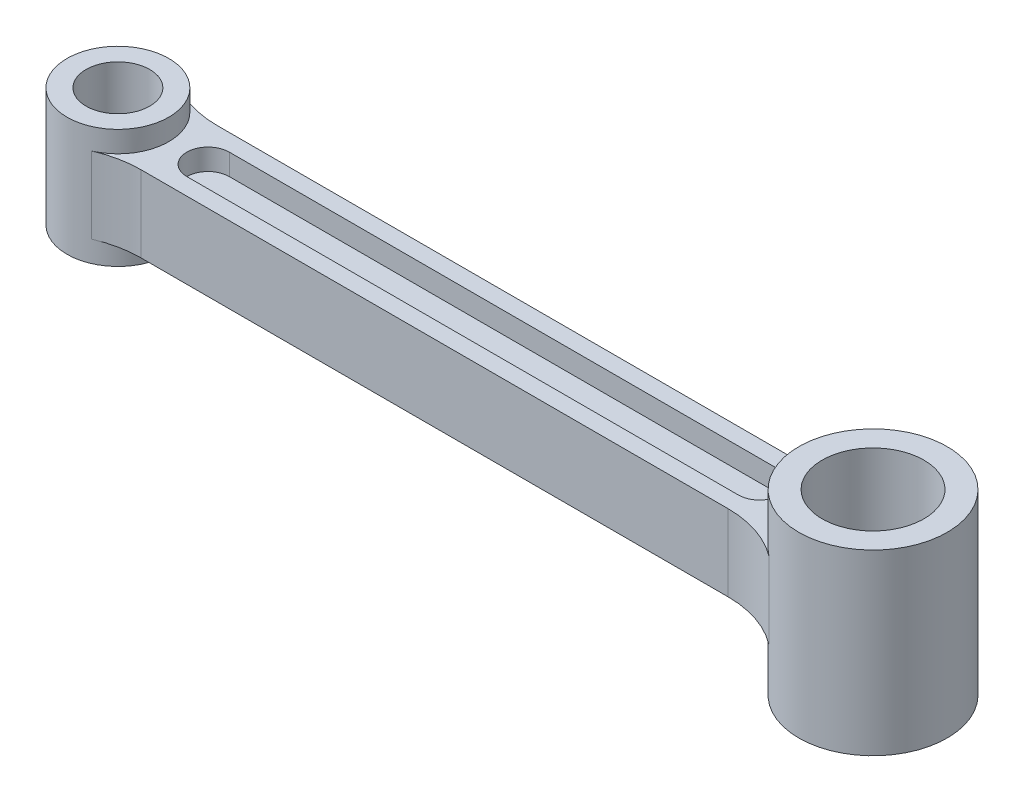
ISO-10303-21;
HEADER;
FILE_DESCRIPTION(('STEP AP214'),'2;1');
FILE_NAME('part.step','',(''),(''),'','','');
FILE_SCHEMA(('AUTOMOTIVE_DESIGN { 1 0 10303 214 1 1 1 1 }'));
ENDSEC;
DATA;
#1=APPLICATION_CONTEXT('core data for automotive mechanical design processes');
#2=APPLICATION_PROTOCOL_DEFINITION('international standard','automotive_design',2000,#1);
#3=PRODUCT_CONTEXT('',#1,'mechanical');
#4=PRODUCT('Part','Part','',(#3));
#5=PRODUCT_RELATED_PRODUCT_CATEGORY('part','',(#4));
#6=PRODUCT_DEFINITION_FORMATION('','',#4);
#7=PRODUCT_DEFINITION_CONTEXT('part definition',#1,'design');
#8=PRODUCT_DEFINITION('design','',#6,#7);
#9=PRODUCT_DEFINITION_SHAPE('','',#8);
#10=(LENGTH_UNIT() NAMED_UNIT(*) SI_UNIT(.MILLI.,.METRE.));
#11=(NAMED_UNIT(*) PLANE_ANGLE_UNIT() SI_UNIT($,.RADIAN.));
#12=(NAMED_UNIT(*) SI_UNIT($,.STERADIAN.) SOLID_ANGLE_UNIT());
#13=UNCERTAINTY_MEASURE_WITH_UNIT(LENGTH_MEASURE(1.E-05),#10,'distance_accuracy_value','');
#14=(GEOMETRIC_REPRESENTATION_CONTEXT(3) GLOBAL_UNCERTAINTY_ASSIGNED_CONTEXT((#13)) GLOBAL_UNIT_ASSIGNED_CONTEXT((#10,
#11,#12)) REPRESENTATION_CONTEXT('',''));
#15=CARTESIAN_POINT('',(0.,0.,0.));
#16=DIRECTION('',(0.,0.,1.));
#17=DIRECTION('',(1.,0.,0.));
#18=AXIS2_PLACEMENT_3D('',#15,#16,#17);
#19=CARTESIAN_POINT('',(0.,-9.,0.));
#20=DIRECTION('',(0.,1.,0.));
#21=DIRECTION('',(0.,0.,1.));
#22=AXIS2_PLACEMENT_3D('',#19,#20,#21);
#23=PLANE('',#22);
#24=CARTESIAN_POINT('',(-39.9456763121572,-9.,33.));
#25=DIRECTION('',(0.,1.,0.));
#26=DIRECTION('',(0.,0.,1.));
#27=AXIS2_PLACEMENT_3D('',#24,#25,#26);
#28=CIRCLE('',#27,24.);
#29=CARTESIAN_POINT('',(-39.9456763121572,-9.,9.));
#30=VERTEX_POINT('',#29);
#31=CARTESIAN_POINT('',(-49.5373393587826,-9.,11.));
#32=VERTEX_POINT('',#31);
#33=EDGE_CURVE('E294',#30,#32,#28,.T.);
#34=ORIENTED_EDGE('',*,*,#33,.T.);
#35=CARTESIAN_POINT('',(-54.3331708820953,-9.,0.));
#36=DIRECTION('',(0.,1.,0.));
#37=DIRECTION('',(0.,0.,1.));
#38=AXIS2_PLACEMENT_3D('',#35,#36,#37);
#39=CIRCLE('',#38,12.);
#40=CARTESIAN_POINT('',(-49.5373393587826,-9.,-11.));
#41=VERTEX_POINT('',#40);
#42=EDGE_CURVE('E305',#32,#41,#39,.T.);
#43=ORIENTED_EDGE('',*,*,#42,.T.);
#44=CARTESIAN_POINT('',(-39.9456763121572,-9.,-33.));
#45=DIRECTION('',(0.,1.,0.));
#46=DIRECTION('',(0.,0.,1.));
#47=AXIS2_PLACEMENT_3D('',#44,#45,#46);
#48=CIRCLE('',#47,24.);
#49=CARTESIAN_POINT('',(-39.9456763121572,-9.,-9.));
#50=VERTEX_POINT('',#49);
#51=EDGE_CURVE('E356',#50,#41,#48,.F.);
#52=ORIENTED_EDGE('',*,*,#51,.F.);
#53=DIRECTION('',(1.,0.,0.));
#54=VECTOR('',#53,1.);
#55=CARTESIAN_POINT('',(0.,-9.,-9.));
#56=LINE('',#55,#54);
#57=CARTESIAN_POINT('',(98.5023700535814,-9.,-9.));
#58=VERTEX_POINT('',#57);
#59=EDGE_CURVE('E352',#50,#58,#56,.T.);
#60=ORIENTED_EDGE('',*,*,#59,.T.);
#61=CARTESIAN_POINT('',(98.5023700535814,-9.,-33.));
#62=DIRECTION('',(0.,1.,0.));
#63=DIRECTION('',(0.,0.,1.));
#64=AXIS2_PLACEMENT_3D('',#61,#62,#63);
#65=CIRCLE('',#64,24.);
#66=CARTESIAN_POINT('',(113.055310235359,-9.,-13.9156626506024));
#67=VERTEX_POINT('',#66);
#68=EDGE_CURVE('E348',#58,#67,#65,.T.);
#69=ORIENTED_EDGE('',*,*,#68,.T.);
#70=CARTESIAN_POINT('',(123.666829117905,-9.,0.));
#71=DIRECTION('',(0.,1.,0.));
#72=DIRECTION('',(0.,0.,1.));
#73=AXIS2_PLACEMENT_3D('',#70,#71,#72);
#74=CIRCLE('',#73,17.5);
#75=CARTESIAN_POINT('',(113.055310235359,-9.,13.9156626506024));
#76=VERTEX_POINT('',#75);
#77=EDGE_CURVE('E344',#67,#76,#74,.T.);
#78=ORIENTED_EDGE('',*,*,#77,.T.);
#79=CARTESIAN_POINT('',(98.5023700535814,-9.,33.));
#80=DIRECTION('',(0.,1.,0.));
#81=DIRECTION('',(0.,0.,1.));
#82=AXIS2_PLACEMENT_3D('',#79,#80,#81);
#83=CIRCLE('',#82,24.);
#84=CARTESIAN_POINT('',(98.5023700535814,-9.,9.));
#85=VERTEX_POINT('',#84);
#86=EDGE_CURVE('E341',#85,#76,#83,.F.);
#87=ORIENTED_EDGE('',*,*,#86,.F.);
#88=DIRECTION('',(1.,0.,0.));
#89=VECTOR('',#88,1.);
#90=CARTESIAN_POINT('',(0.,-9.,9.));
#91=LINE('',#90,#89);
#92=EDGE_CURVE('E337',#30,#85,#91,.T.);
#93=ORIENTED_EDGE('',*,*,#92,.F.);
#94=EDGE_LOOP('',(#34,#43,#52,#60,#69,#78,#87,#93));
#95=FACE_BOUND('',#94,.T.);
#96=CARTESIAN_POINT('',(-33.0831708820953,-9.,0.));
#97=DIRECTION('',(0.,1.,0.));
#98=DIRECTION('',(0.,0.,1.));
#99=AXIS2_PLACEMENT_3D('',#96,#97,#98);
#100=CIRCLE('',#99,5.);
#101=CARTESIAN_POINT('',(-33.0831708820953,-9.,-5.));
#102=VERTEX_POINT('',#101);
#103=CARTESIAN_POINT('',(-33.0831708820953,-9.,5.));
#104=VERTEX_POINT('',#103);
#105=EDGE_CURVE('E95',#102,#104,#100,.T.);
#106=ORIENTED_EDGE('',*,*,#105,.T.);
#107=DIRECTION('',(1.,0.,0.));
#108=VECTOR('',#107,1.);
#109=CARTESIAN_POINT('',(-33.0831708820953,-9.,5.));
#110=LINE('',#109,#108);
#111=CARTESIAN_POINT('',(96.9168291179047,-9.,5.));
#112=VERTEX_POINT('',#111);
#113=EDGE_CURVE('E211',#104,#112,#110,.T.);
#114=ORIENTED_EDGE('',*,*,#113,.T.);
#115=CARTESIAN_POINT('',(96.9168291179047,-9.,0.));
#116=DIRECTION('',(0.,1.,0.));
#117=DIRECTION('',(0.,0.,1.));
#118=AXIS2_PLACEMENT_3D('',#115,#116,#117);
#119=CIRCLE('',#118,5.);
#120=CARTESIAN_POINT('',(96.9168291179047,-9.,-5.));
#121=VERTEX_POINT('',#120);
#122=EDGE_CURVE('E228',#112,#121,#119,.T.);
#123=ORIENTED_EDGE('',*,*,#122,.T.);
#124=DIRECTION('',(1.,0.,0.));
#125=VECTOR('',#124,1.);
#126=CARTESIAN_POINT('',(-33.0831708820953,-9.,-5.));
#127=LINE('',#126,#125);
#128=EDGE_CURVE('E225',#102,#121,#127,.T.);
#129=ORIENTED_EDGE('',*,*,#128,.F.);
#130=EDGE_LOOP('',(#106,#114,#123,#129));
#131=FACE_BOUND('',#130,.T.);
#132=ADVANCED_FACE('F77',(#95,#131),#23,.F.);
#133=CARTESIAN_POINT('',(-54.3331708820953,14.,0.));
#134=DIRECTION('',(0.,-1.,0.));
#135=DIRECTION('',(0.,0.,-1.));
#136=AXIS2_PLACEMENT_3D('',#133,#134,#135);
#137=CYLINDRICAL_SURFACE('',#136,12.);
#138=CARTESIAN_POINT('',(-54.3331708820953,-14.,0.));
#139=DIRECTION('',(0.,1.,0.));
#140=DIRECTION('',(0.,0.,1.));
#141=AXIS2_PLACEMENT_3D('',#138,#139,#140);
#142=CIRCLE('',#141,12.);
#143=CARTESIAN_POINT('',(-54.3331708820953,-14.,12.));
#144=VERTEX_POINT('',#143);
#145=EDGE_CURVE('E81',#144,#144,#142,.T.);
#146=ORIENTED_EDGE('',*,*,#145,.T.);
#147=EDGE_LOOP('',(#146));
#148=FACE_BOUND('',#147,.T.);
#149=CARTESIAN_POINT('',(-54.3331708820953,14.,0.));
#150=DIRECTION('',(0.,1.,0.));
#151=DIRECTION('',(0.,0.,1.));
#152=AXIS2_PLACEMENT_3D('',#149,#150,#151);
#153=CIRCLE('',#152,12.);
#154=CARTESIAN_POINT('',(-54.3331708820953,14.,12.));
#155=VERTEX_POINT('',#154);
#156=EDGE_CURVE('E12',#155,#155,#153,.T.);
#157=ORIENTED_EDGE('',*,*,#156,.F.);
#158=EDGE_LOOP('',(#157));
#159=FACE_BOUND('',#158,.T.);
#160=ORIENTED_EDGE('',*,*,#42,.F.);
#161=DIRECTION('',(0.,-1.,0.));
#162=VECTOR('',#161,1.);
#163=CARTESIAN_POINT('',(-49.5373393587826,9.,11.));
#164=LINE('',#163,#162);
#165=CARTESIAN_POINT('',(-49.5373393587826,9.,11.));
#166=VERTEX_POINT('',#165);
#167=EDGE_CURVE('E333',#166,#32,#164,.T.);
#168=ORIENTED_EDGE('',*,*,#167,.F.);
#169=CARTESIAN_POINT('',(-54.3331708820953,9.,0.));
#170=DIRECTION('',(0.,1.,0.));
#171=DIRECTION('',(0.,0.,1.));
#172=AXIS2_PLACEMENT_3D('',#169,#170,#171);
#173=CIRCLE('',#172,12.);
#174=CARTESIAN_POINT('',(-49.5373393587826,9.,-11.));
#175=VERTEX_POINT('',#174);
#176=EDGE_CURVE('E329',#166,#175,#173,.T.);
#177=ORIENTED_EDGE('',*,*,#176,.T.);
#178=DIRECTION('',(0.,-1.,0.));
#179=VECTOR('',#178,1.);
#180=CARTESIAN_POINT('',(-49.5373393587826,9.,-11.));
#181=LINE('',#180,#179);
#182=EDGE_CURVE('E364',#175,#41,#181,.T.);
#183=ORIENTED_EDGE('',*,*,#182,.T.);
#184=EDGE_LOOP('',(#160,#168,#177,#183));
#185=FACE_BOUND('',#184,.T.);
#186=ADVANCED_FACE('F399',(#148,#159,#185),#137,.T.);
#187=CARTESIAN_POINT('',(-54.3331708820953,14.,0.));
#188=DIRECTION('',(0.,-1.,0.));
#189=DIRECTION('',(0.,0.,-1.));
#190=AXIS2_PLACEMENT_3D('',#187,#188,#189);
#191=CYLINDRICAL_SURFACE('',#190,7.5);
#192=CARTESIAN_POINT('',(-54.3331708820953,14.,0.));
#193=DIRECTION('',(0.,1.,0.));
#194=DIRECTION('',(0.,0.,1.));
#195=AXIS2_PLACEMENT_3D('',#192,#193,#194);
#196=CIRCLE('',#195,7.5);
#197=CARTESIAN_POINT('',(-54.3331708820953,14.,7.5));
#198=VERTEX_POINT('',#197);
#199=EDGE_CURVE('E87',#198,#198,#196,.T.);
#200=ORIENTED_EDGE('',*,*,#199,.T.);
#201=EDGE_LOOP('',(#200));
#202=FACE_BOUND('',#201,.T.);
#203=CARTESIAN_POINT('',(-54.3331708820953,-14.,0.));
#204=DIRECTION('',(0.,1.,0.));
#205=DIRECTION('',(0.,0.,1.));
#206=AXIS2_PLACEMENT_3D('',#203,#204,#205);
#207=CIRCLE('',#206,7.5);
#208=CARTESIAN_POINT('',(-54.3331708820953,-14.,7.5));
#209=VERTEX_POINT('',#208);
#210=EDGE_CURVE('E388',#209,#209,#207,.T.);
#211=ORIENTED_EDGE('',*,*,#210,.F.);
#212=EDGE_LOOP('',(#211));
#213=FACE_BOUND('',#212,.T.);
#214=ADVANCED_FACE('F79',(#202,#213),#191,.F.);
#215=CARTESIAN_POINT('',(0.,14.,0.));
#216=DIRECTION('',(0.,1.,0.));
#217=DIRECTION('',(0.,0.,1.));
#218=AXIS2_PLACEMENT_3D('',#215,#216,#217);
#219=PLANE('',#218);
#220=ORIENTED_EDGE('',*,*,#199,.F.);
#221=EDGE_LOOP('',(#220));
#222=FACE_BOUND('',#221,.T.);
#223=ORIENTED_EDGE('',*,*,#156,.T.);
#224=EDGE_LOOP('',(#223));
#225=FACE_BOUND('',#224,.T.);
#226=ADVANCED_FACE('F405',(#222,#225),#219,.T.);
#227=CARTESIAN_POINT('',(0.,-14.,0.));
#228=DIRECTION('',(0.,1.,0.));
#229=DIRECTION('',(0.,0.,1.));
#230=AXIS2_PLACEMENT_3D('',#227,#228,#229);
#231=PLANE('',#230);
#232=ORIENTED_EDGE('',*,*,#210,.T.);
#233=EDGE_LOOP('',(#232));
#234=FACE_BOUND('',#233,.T.);
#235=ORIENTED_EDGE('',*,*,#145,.F.);
#236=EDGE_LOOP('',(#235));
#237=FACE_BOUND('',#236,.T.);
#238=ADVANCED_FACE('F402',(#234,#237),#231,.F.);
#239=CARTESIAN_POINT('',(0.,9.,9.));
#240=DIRECTION('',(0.,0.,-1.));
#241=DIRECTION('',(-1.,0.,0.));
#242=AXIS2_PLACEMENT_3D('',#239,#240,#241);
#243=PLANE('',#242);
#244=ORIENTED_EDGE('',*,*,#92,.T.);
#245=DIRECTION('',(0.,-1.,0.));
#246=VECTOR('',#245,1.);
#247=CARTESIAN_POINT('',(98.5023700535814,9.,9.));
#248=LINE('',#247,#246);
#249=CARTESIAN_POINT('',(98.5023700535814,9.,9.));
#250=VERTEX_POINT('',#249);
#251=EDGE_CURVE('E381',#250,#85,#248,.T.);
#252=ORIENTED_EDGE('',*,*,#251,.F.);
#253=DIRECTION('',(1.,0.,0.));
#254=VECTOR('',#253,1.);
#255=CARTESIAN_POINT('',(0.,9.,9.));
#256=LINE('',#255,#254);
#257=CARTESIAN_POINT('',(-39.9456763121572,9.,9.));
#258=VERTEX_POINT('',#257);
#259=EDGE_CURVE('E304',#258,#250,#256,.T.);
#260=ORIENTED_EDGE('',*,*,#259,.F.);
#261=DIRECTION('',(0.,-1.,0.));
#262=VECTOR('',#261,1.);
#263=CARTESIAN_POINT('',(-39.9456763121572,9.,9.));
#264=LINE('',#263,#262);
#265=EDGE_CURVE('E385',#258,#30,#264,.T.);
#266=ORIENTED_EDGE('',*,*,#265,.T.);
#267=EDGE_LOOP('',(#244,#252,#260,#266));
#268=FACE_BOUND('',#267,.T.);
#269=ADVANCED_FACE('F404',(#268),#243,.F.);
#270=CARTESIAN_POINT('',(98.5023700535814,9.,33.));
#271=DIRECTION('',(0.,-1.,0.));
#272=DIRECTION('',(0.,0.,-1.));
#273=AXIS2_PLACEMENT_3D('',#270,#271,#272);
#274=CYLINDRICAL_SURFACE('',#273,24.);
#275=ORIENTED_EDGE('',*,*,#86,.T.);
#276=DIRECTION('',(0.,-1.,0.));
#277=VECTOR('',#276,1.);
#278=CARTESIAN_POINT('',(113.055310235359,9.,13.9156626506024));
#279=LINE('',#278,#277);
#280=CARTESIAN_POINT('',(113.055310235359,9.,13.9156626506024));
#281=VERTEX_POINT('',#280);
#282=EDGE_CURVE('E377',#281,#76,#279,.T.);
#283=ORIENTED_EDGE('',*,*,#282,.F.);
#284=CARTESIAN_POINT('',(98.5023700535814,9.,33.));
#285=DIRECTION('',(0.,1.,0.));
#286=DIRECTION('',(0.,0.,1.));
#287=AXIS2_PLACEMENT_3D('',#284,#285,#286);
#288=CIRCLE('',#287,24.);
#289=EDGE_CURVE('E309',#250,#281,#288,.F.);
#290=ORIENTED_EDGE('',*,*,#289,.F.);
#291=ORIENTED_EDGE('',*,*,#251,.T.);
#292=EDGE_LOOP('',(#275,#283,#290,#291));
#293=FACE_BOUND('',#292,.T.);
#294=ADVANCED_FACE('F411',(#293),#274,.F.);
#295=CARTESIAN_POINT('',(98.5023700535814,9.,-33.));
#296=DIRECTION('',(0.,-1.,0.));
#297=DIRECTION('',(0.,0.,-1.));
#298=AXIS2_PLACEMENT_3D('',#295,#296,#297);
#299=CYLINDRICAL_SURFACE('',#298,24.);
#300=ORIENTED_EDGE('',*,*,#68,.F.);
#301=DIRECTION('',(0.,-1.,0.));
#302=VECTOR('',#301,1.);
#303=CARTESIAN_POINT('',(98.5023700535814,9.,-9.));
#304=LINE('',#303,#302);
#305=CARTESIAN_POINT('',(98.5023700535814,9.,-9.));
#306=VERTEX_POINT('',#305);
#307=EDGE_CURVE('E371',#306,#58,#304,.T.);
#308=ORIENTED_EDGE('',*,*,#307,.F.);
#309=CARTESIAN_POINT('',(98.5023700535814,9.,-33.));
#310=DIRECTION('',(0.,1.,0.));
#311=DIRECTION('',(0.,0.,1.));
#312=AXIS2_PLACEMENT_3D('',#309,#310,#311);
#313=CIRCLE('',#312,24.);
#314=CARTESIAN_POINT('',(113.055310235359,9.,-13.9156626506024));
#315=VERTEX_POINT('',#314);
#316=EDGE_CURVE('E317',#306,#315,#313,.T.);
#317=ORIENTED_EDGE('',*,*,#316,.T.);
#318=DIRECTION('',(0.,-1.,0.));
#319=VECTOR('',#318,1.);
#320=CARTESIAN_POINT('',(113.055310235359,9.,-13.9156626506024));
#321=LINE('',#320,#319);
#322=EDGE_CURVE('E374',#315,#67,#321,.T.);
#323=ORIENTED_EDGE('',*,*,#322,.T.);
#324=EDGE_LOOP('',(#300,#308,#317,#323));
#325=FACE_BOUND('',#324,.T.);
#326=ADVANCED_FACE('F435',(#325),#299,.F.);
#327=CARTESIAN_POINT('',(0.,9.,-9.));
#328=DIRECTION('',(0.,0.,-1.));
#329=DIRECTION('',(-1.,0.,0.));
#330=AXIS2_PLACEMENT_3D('',#327,#328,#329);
#331=PLANE('',#330);
#332=ORIENTED_EDGE('',*,*,#59,.F.);
#333=DIRECTION('',(0.,-1.,0.));
#334=VECTOR('',#333,1.);
#335=CARTESIAN_POINT('',(-39.9456763121572,9.,-9.));
#336=LINE('',#335,#334);
#337=CARTESIAN_POINT('',(-39.9456763121572,9.,-9.));
#338=VERTEX_POINT('',#337);
#339=EDGE_CURVE('E368',#338,#50,#336,.T.);
#340=ORIENTED_EDGE('',*,*,#339,.F.);
#341=DIRECTION('',(1.,0.,0.));
#342=VECTOR('',#341,1.);
#343=CARTESIAN_POINT('',(0.,9.,-9.));
#344=LINE('',#343,#342);
#345=EDGE_CURVE('E321',#338,#306,#344,.T.);
#346=ORIENTED_EDGE('',*,*,#345,.T.);
#347=ORIENTED_EDGE('',*,*,#307,.T.);
#348=EDGE_LOOP('',(#332,#340,#346,#347));
#349=FACE_BOUND('',#348,.T.);
#350=ADVANCED_FACE('F431',(#349),#331,.T.);
#351=CARTESIAN_POINT('',(-39.9456763121572,9.,-33.));
#352=DIRECTION('',(0.,-1.,0.));
#353=DIRECTION('',(0.,0.,-1.));
#354=AXIS2_PLACEMENT_3D('',#351,#352,#353);
#355=CYLINDRICAL_SURFACE('',#354,24.);
#356=ORIENTED_EDGE('',*,*,#51,.T.);
#357=ORIENTED_EDGE('',*,*,#182,.F.);
#358=CARTESIAN_POINT('',(-39.9456763121572,9.,-33.));
#359=DIRECTION('',(0.,1.,0.));
#360=DIRECTION('',(0.,0.,1.));
#361=AXIS2_PLACEMENT_3D('',#358,#359,#360);
#362=CIRCLE('',#361,24.);
#363=EDGE_CURVE('E325',#338,#175,#362,.F.);
#364=ORIENTED_EDGE('',*,*,#363,.F.);
#365=ORIENTED_EDGE('',*,*,#339,.T.);
#366=EDGE_LOOP('',(#356,#357,#364,#365));
#367=FACE_BOUND('',#366,.T.);
#368=ADVANCED_FACE('F427',(#367),#355,.F.);
#369=CARTESIAN_POINT('',(-39.9456763121572,9.,33.));
#370=DIRECTION('',(0.,-1.,0.));
#371=DIRECTION('',(0.,0.,-1.));
#372=AXIS2_PLACEMENT_3D('',#369,#370,#371);
#373=CYLINDRICAL_SURFACE('',#372,24.);
#374=ORIENTED_EDGE('',*,*,#33,.F.);
#375=ORIENTED_EDGE('',*,*,#265,.F.);
#376=CARTESIAN_POINT('',(-39.9456763121572,9.,33.));
#377=DIRECTION('',(0.,1.,0.));
#378=DIRECTION('',(0.,0.,1.));
#379=AXIS2_PLACEMENT_3D('',#376,#377,#378);
#380=CIRCLE('',#379,24.);
#381=EDGE_CURVE('E301',#258,#166,#380,.T.);
#382=ORIENTED_EDGE('',*,*,#381,.T.);
#383=ORIENTED_EDGE('',*,*,#167,.T.);
#384=EDGE_LOOP('',(#374,#375,#382,#383));
#385=FACE_BOUND('',#384,.T.);
#386=ADVANCED_FACE('F430',(#385),#373,.F.);
#387=CARTESIAN_POINT('',(0.,9.,0.));
#388=DIRECTION('',(0.,1.,0.));
#389=DIRECTION('',(0.,0.,1.));
#390=AXIS2_PLACEMENT_3D('',#387,#388,#389);
#391=PLANE('',#390);
#392=CARTESIAN_POINT('',(-33.0831708820953,9.,0.));
#393=DIRECTION('',(0.,1.,0.));
#394=DIRECTION('',(0.,0.,1.));
#395=AXIS2_PLACEMENT_3D('',#392,#393,#394);
#396=CIRCLE('',#395,5.);
#397=CARTESIAN_POINT('',(-33.0831708820953,9.,-5.));
#398=VERTEX_POINT('',#397);
#399=CARTESIAN_POINT('',(-33.0831708820953,9.,5.));
#400=VERTEX_POINT('',#399);
#401=EDGE_CURVE('E103',#398,#400,#396,.T.);
#402=ORIENTED_EDGE('',*,*,#401,.F.);
#403=DIRECTION('',(1.,0.,0.));
#404=VECTOR('',#403,1.);
#405=CARTESIAN_POINT('',(-33.0831708820953,9.,-5.));
#406=LINE('',#405,#404);
#407=CARTESIAN_POINT('',(96.9168291179047,9.,-5.));
#408=VERTEX_POINT('',#407);
#409=EDGE_CURVE('E248',#398,#408,#406,.T.);
#410=ORIENTED_EDGE('',*,*,#409,.T.);
#411=CARTESIAN_POINT('',(96.9168291179047,9.,0.));
#412=DIRECTION('',(0.,1.,0.));
#413=DIRECTION('',(0.,0.,1.));
#414=AXIS2_PLACEMENT_3D('',#411,#412,#413);
#415=CIRCLE('',#414,5.);
#416=CARTESIAN_POINT('',(96.9168291179047,9.,5.));
#417=VERTEX_POINT('',#416);
#418=EDGE_CURVE('E266',#417,#408,#415,.T.);
#419=ORIENTED_EDGE('',*,*,#418,.F.);
#420=DIRECTION('',(1.,0.,0.));
#421=VECTOR('',#420,1.);
#422=CARTESIAN_POINT('',(-33.0831708820953,9.,5.));
#423=LINE('',#422,#421);
#424=EDGE_CURVE('E262',#400,#417,#423,.T.);
#425=ORIENTED_EDGE('',*,*,#424,.F.);
#426=EDGE_LOOP('',(#402,#410,#419,#425));
#427=FACE_BOUND('',#426,.T.);
#428=ORIENTED_EDGE('',*,*,#381,.F.);
#429=ORIENTED_EDGE('',*,*,#259,.T.);
#430=ORIENTED_EDGE('',*,*,#289,.T.);
#431=CARTESIAN_POINT('',(123.666829117905,9.,0.));
#432=DIRECTION('',(0.,1.,0.));
#433=DIRECTION('',(0.,0.,1.));
#434=AXIS2_PLACEMENT_3D('',#431,#432,#433);
#435=CIRCLE('',#434,17.5);
#436=EDGE_CURVE('E313',#315,#281,#435,.T.);
#437=ORIENTED_EDGE('',*,*,#436,.F.);
#438=ORIENTED_EDGE('',*,*,#316,.F.);
#439=ORIENTED_EDGE('',*,*,#345,.F.);
#440=ORIENTED_EDGE('',*,*,#363,.T.);
#441=ORIENTED_EDGE('',*,*,#176,.F.);
#442=EDGE_LOOP('',(#428,#429,#430,#437,#438,#439,#440,#441));
#443=FACE_BOUND('',#442,.T.);
#444=ADVANCED_FACE('F425',(#427,#443),#391,.T.);
#445=CARTESIAN_POINT('',(123.666829117905,21.,0.));
#446=DIRECTION('',(0.,-1.,0.));
#447=DIRECTION('',(0.,0.,-1.));
#448=AXIS2_PLACEMENT_3D('',#445,#446,#447);
#449=CYLINDRICAL_SURFACE('',#448,17.5);
#450=CARTESIAN_POINT('',(123.666829117905,21.,0.));
#451=DIRECTION('',(0.,1.,0.));
#452=DIRECTION('',(0.,0.,1.));
#453=AXIS2_PLACEMENT_3D('',#450,#451,#452);
#454=CIRCLE('',#453,17.5);
#455=CARTESIAN_POINT('',(123.666829117905,21.,17.5));
#456=VERTEX_POINT('',#455);
#457=EDGE_CURVE('E289',#456,#456,#454,.T.);
#458=ORIENTED_EDGE('',*,*,#457,.F.);
#459=EDGE_LOOP('',(#458));
#460=FACE_BOUND('',#459,.T.);
#461=CARTESIAN_POINT('',(123.666829117905,-21.,0.));
#462=DIRECTION('',(0.,1.,0.));
#463=DIRECTION('',(0.,0.,1.));
#464=AXIS2_PLACEMENT_3D('',#461,#462,#463);
#465=CIRCLE('',#464,17.5);
#466=CARTESIAN_POINT('',(123.666829117905,-21.,17.5));
#467=VERTEX_POINT('',#466);
#468=EDGE_CURVE('E290',#467,#467,#465,.T.);
#469=ORIENTED_EDGE('',*,*,#468,.T.);
#470=EDGE_LOOP('',(#469));
#471=FACE_BOUND('',#470,.T.);
#472=ORIENTED_EDGE('',*,*,#282,.T.);
#473=ORIENTED_EDGE('',*,*,#77,.F.);
#474=ORIENTED_EDGE('',*,*,#322,.F.);
#475=ORIENTED_EDGE('',*,*,#436,.T.);
#476=EDGE_LOOP('',(#472,#473,#474,#475));
#477=FACE_BOUND('',#476,.T.);
#478=ADVANCED_FACE('F448',(#460,#471,#477),#449,.T.);
#479=CARTESIAN_POINT('',(123.666829117905,21.,0.));
#480=DIRECTION('',(0.,-1.,0.));
#481=DIRECTION('',(0.,0.,-1.));
#482=AXIS2_PLACEMENT_3D('',#479,#480,#481);
#483=CYLINDRICAL_SURFACE('',#482,12.);
#484=CARTESIAN_POINT('',(123.666829117905,21.,0.));
#485=DIRECTION('',(0.,1.,0.));
#486=DIRECTION('',(0.,0.,1.));
#487=AXIS2_PLACEMENT_3D('',#484,#485,#486);
#488=CIRCLE('',#487,12.);
#489=CARTESIAN_POINT('',(123.666829117905,21.,-12.));
#490=VERTEX_POINT('',#489);
#491=EDGE_CURVE('E285',#490,#490,#488,.T.);
#492=CARTESIAN_POINT('',(123.666829117905,-21.,0.));
#493=DIRECTION('',(0.,1.,0.));
#494=DIRECTION('',(0.,0.,1.));
#495=AXIS2_PLACEMENT_3D('',#492,#493,#494);
#496=CIRCLE('',#495,12.);
#497=CARTESIAN_POINT('',(123.666829117905,-21.,-12.));
#498=VERTEX_POINT('',#497);
#499=EDGE_CURVE('E276',#498,#498,#496,.T.);
#500=CARTESIAN_POINT('',(123.666829117905,21.,-12.));
#501=CARTESIAN_POINT('',(123.666829117905,20.5625,-12.));
#502=CARTESIAN_POINT('',(123.666829117905,20.125,-12.));
#503=CARTESIAN_POINT('',(123.666829117905,19.25,-12.));
#504=CARTESIAN_POINT('',(123.666829117905,18.8125,-12.));
#505=CARTESIAN_POINT('',(123.666829117905,17.9375,-12.));
#506=CARTESIAN_POINT('',(123.666829117905,17.5,-12.));
#507=CARTESIAN_POINT('',(123.666829117905,16.625,-12.));
#508=CARTESIAN_POINT('',(123.666829117905,16.1875,-12.));
#509=CARTESIAN_POINT('',(123.666829117905,15.3125,-12.));
#510=CARTESIAN_POINT('',(123.666829117905,14.875,-12.));
#511=CARTESIAN_POINT('',(123.666829117905,14.,-12.));
#512=CARTESIAN_POINT('',(123.666829117905,13.5625,-12.));
#513=CARTESIAN_POINT('',(123.666829117905,12.6875,-12.));
#514=CARTESIAN_POINT('',(123.666829117905,12.25,-12.));
#515=CARTESIAN_POINT('',(123.666829117905,11.375,-12.));
#516=CARTESIAN_POINT('',(123.666829117905,10.9375,-12.));
#517=CARTESIAN_POINT('',(123.666829117905,10.0625,-12.));
#518=CARTESIAN_POINT('',(123.666829117905,9.625,-12.));
#519=CARTESIAN_POINT('',(123.666829117905,8.75,-12.));
#520=CARTESIAN_POINT('',(123.666829117905,8.3125,-12.));
#521=CARTESIAN_POINT('',(123.666829117905,7.4375,-12.));
#522=CARTESIAN_POINT('',(123.666829117905,7.,-12.));
#523=CARTESIAN_POINT('',(123.666829117905,6.125,-12.));
#524=CARTESIAN_POINT('',(123.666829117905,5.6875,-12.));
#525=CARTESIAN_POINT('',(123.666829117905,4.8125,-12.));
#526=CARTESIAN_POINT('',(123.666829117905,4.375,-12.));
#527=CARTESIAN_POINT('',(123.666829117905,3.5,-12.));
#528=CARTESIAN_POINT('',(123.666829117905,3.0625,-12.));
#529=CARTESIAN_POINT('',(123.666829117905,2.1875,-12.));
#530=CARTESIAN_POINT('',(123.666829117905,1.75,-12.));
#531=CARTESIAN_POINT('',(123.666829117905,0.874999999999997,-12.));
#532=CARTESIAN_POINT('',(123.666829117905,0.437499999999997,-12.));
#533=CARTESIAN_POINT('',(123.666829117905,-0.437500000000004,-12.));
#534=CARTESIAN_POINT('',(123.666829117905,-0.875000000000004,-12.));
#535=CARTESIAN_POINT('',(123.666829117905,-1.75000000000001,-12.));
#536=CARTESIAN_POINT('',(123.666829117905,-2.18750000000001,-12.));
#537=CARTESIAN_POINT('',(123.666829117905,-3.0625,-12.));
#538=CARTESIAN_POINT('',(123.666829117905,-3.5,-12.));
#539=CARTESIAN_POINT('',(123.666829117905,-4.375,-12.));
#540=CARTESIAN_POINT('',(123.666829117905,-4.8125,-12.));
#541=CARTESIAN_POINT('',(123.666829117905,-5.68750000000001,-12.));
#542=CARTESIAN_POINT('',(123.666829117905,-6.12500000000001,-12.));
#543=CARTESIAN_POINT('',(123.666829117905,-7.00000000000001,-12.));
#544=CARTESIAN_POINT('',(123.666829117905,-7.4375,-12.));
#545=CARTESIAN_POINT('',(123.666829117905,-8.3125,-12.));
#546=CARTESIAN_POINT('',(123.666829117905,-8.75,-12.));
#547=CARTESIAN_POINT('',(123.666829117905,-9.625,-12.));
#548=CARTESIAN_POINT('',(123.666829117905,-10.0625,-12.));
#549=CARTESIAN_POINT('',(123.666829117905,-10.9375,-12.));
#550=CARTESIAN_POINT('',(123.666829117905,-11.375,-12.));
#551=CARTESIAN_POINT('',(123.666829117905,-12.25,-12.));
#552=CARTESIAN_POINT('',(123.666829117905,-12.6875,-12.));
#553=CARTESIAN_POINT('',(123.666829117905,-13.5625,-12.));
#554=CARTESIAN_POINT('',(123.666829117905,-14.,-12.));
#555=CARTESIAN_POINT('',(123.666829117905,-14.875,-12.));
#556=CARTESIAN_POINT('',(123.666829117905,-15.3125,-12.));
#557=CARTESIAN_POINT('',(123.666829117905,-16.1875,-12.));
#558=CARTESIAN_POINT('',(123.666829117905,-16.625,-12.));
#559=CARTESIAN_POINT('',(123.666829117905,-17.5,-12.));
#560=CARTESIAN_POINT('',(123.666829117905,-17.9375,-12.));
#561=CARTESIAN_POINT('',(123.666829117905,-18.8125,-12.));
#562=CARTESIAN_POINT('',(123.666829117905,-19.25,-12.));
#563=CARTESIAN_POINT('',(123.666829117905,-20.125,-12.));
#564=CARTESIAN_POINT('',(123.666829117905,-20.5625,-12.));
#565=CARTESIAN_POINT('',(123.666829117905,-21.,-12.));
#566=B_SPLINE_CURVE_WITH_KNOTS('',3,(#500,#501,#502,#503,#504,#505,#506,#507,#508,#509,#510,
#511,#512,#513,#514,#515,#516,#517,#518,#519,#520,#521,#522,#523,#524,#525,#526,#527,#528,#529,
#530,#531,#532,#533,#534,#535,#536,#537,#538,#539,#540,#541,#542,#543,#544,#545,#546,#547,#548,
#549,#550,#551,#552,#553,#554,#555,#556,#557,#558,#559,#560,#561,#562,#563,#564,#565),
.UNSPECIFIED.,.F.,.F.,(4,2,2,2,2,2,2,2,2,2,2,2,2,2,2,2,2,2,2,2,2,2,2,2,2,2,2,2,2,2,2,2,4),(0.,
1.3125,2.625,3.9375,5.25,6.5625,7.875,9.1875,10.5,11.8125,13.125,14.4375,15.75,17.0625,18.375,
19.6875,21.,22.3125,23.625,24.9375,26.25,27.5625,28.875,30.1875,31.5,32.8125,34.125,35.4375,
36.75,38.0625,39.375,40.6875,42.),.UNSPECIFIED.);
#567=EDGE_CURVE('BSEAM470',#490,#498,#566,.T.);
#568=ORIENTED_EDGE('',*,*,#491,.T.);
#569=ORIENTED_EDGE('',*,*,#499,.F.);
#570=ORIENTED_EDGE('',*,*,#567,.T.);
#571=ORIENTED_EDGE('',*,*,#567,.F.);
#572=EDGE_LOOP('',(#568,#570,#569,#571));
#573=FACE_BOUND('',#572,.T.);
#574=ADVANCED_FACE('F470',(#573),#483,.F.);
#575=CARTESIAN_POINT('',(0.,21.,0.));
#576=DIRECTION('',(0.,1.,0.));
#577=DIRECTION('',(0.,0.,1.));
#578=AXIS2_PLACEMENT_3D('',#575,#576,#577);
#579=PLANE('',#578);
#580=ORIENTED_EDGE('',*,*,#491,.F.);
#581=EDGE_LOOP('',(#580));
#582=FACE_BOUND('',#581,.T.);
#583=ORIENTED_EDGE('',*,*,#457,.T.);
#584=EDGE_LOOP('',(#583));
#585=FACE_BOUND('',#584,.T.);
#586=ADVANCED_FACE('F476',(#582,#585),#579,.T.);
#587=CARTESIAN_POINT('',(0.,-21.,0.));
#588=DIRECTION('',(0.,1.,0.));
#589=DIRECTION('',(0.,0.,1.));
#590=AXIS2_PLACEMENT_3D('',#587,#588,#589);
#591=PLANE('',#590);
#592=ORIENTED_EDGE('',*,*,#499,.T.);
#593=EDGE_LOOP('',(#592));
#594=FACE_BOUND('',#593,.T.);
#595=ORIENTED_EDGE('',*,*,#468,.F.);
#596=EDGE_LOOP('',(#595));
#597=FACE_BOUND('',#596,.T.);
#598=ADVANCED_FACE('F481',(#594,#597),#591,.F.);
#599=CARTESIAN_POINT('',(-33.0831708820953,4.,0.));
#600=DIRECTION('',(0.,1.,0.));
#601=DIRECTION('',(0.,0.,1.));
#602=AXIS2_PLACEMENT_3D('',#599,#600,#601);
#603=CYLINDRICAL_SURFACE('',#602,5.);
#604=ORIENTED_EDGE('',*,*,#401,.T.);
#605=DIRECTION('',(0.,1.,0.));
#606=VECTOR('',#605,1.);
#607=CARTESIAN_POINT('',(-33.0831708820953,4.,5.));
#608=LINE('',#607,#606);
#609=CARTESIAN_POINT('',(-33.0831708820953,4.,5.));
#610=VERTEX_POINT('',#609);
#611=EDGE_CURVE('E259',#610,#400,#608,.T.);
#612=ORIENTED_EDGE('',*,*,#611,.F.);
#613=CARTESIAN_POINT('',(-33.0831708820953,4.,0.));
#614=DIRECTION('',(0.,1.,0.));
#615=DIRECTION('',(0.,0.,1.));
#616=AXIS2_PLACEMENT_3D('',#613,#614,#615);
#617=CIRCLE('',#616,5.);
#618=CARTESIAN_POINT('',(-33.0831708820953,4.,-5.));
#619=VERTEX_POINT('',#618);
#620=EDGE_CURVE('E243',#619,#610,#617,.T.);
#621=ORIENTED_EDGE('',*,*,#620,.F.);
#622=DIRECTION('',(0.,1.,0.));
#623=VECTOR('',#622,1.);
#624=CARTESIAN_POINT('',(-33.0831708820953,4.,-5.));
#625=LINE('',#624,#623);
#626=EDGE_CURVE('E273',#619,#398,#625,.T.);
#627=ORIENTED_EDGE('',*,*,#626,.T.);
#628=EDGE_LOOP('',(#604,#612,#621,#627));
#629=FACE_BOUND('',#628,.T.);
#630=ADVANCED_FACE('F484',(#629),#603,.F.);
#631=CARTESIAN_POINT('',(-33.0831708820953,4.,-5.));
#632=DIRECTION('',(0.,0.,1.));
#633=DIRECTION('',(1.,0.,0.));
#634=AXIS2_PLACEMENT_3D('',#631,#632,#633);
#635=PLANE('',#634);
#636=ORIENTED_EDGE('',*,*,#409,.F.);
#637=ORIENTED_EDGE('',*,*,#626,.F.);
#638=DIRECTION('',(1.,0.,0.));
#639=VECTOR('',#638,1.);
#640=CARTESIAN_POINT('',(-33.0831708820953,4.,-5.));
#641=LINE('',#640,#639);
#642=CARTESIAN_POINT('',(96.9168291179047,4.,-5.));
#643=VERTEX_POINT('',#642);
#644=EDGE_CURVE('E256',#619,#643,#641,.T.);
#645=ORIENTED_EDGE('',*,*,#644,.T.);
#646=DIRECTION('',(0.,1.,0.));
#647=VECTOR('',#646,1.);
#648=CARTESIAN_POINT('',(96.9168291179047,4.,-5.));
#649=LINE('',#648,#647);
#650=EDGE_CURVE('E277',#643,#408,#649,.T.);
#651=ORIENTED_EDGE('',*,*,#650,.T.);
#652=EDGE_LOOP('',(#636,#637,#645,#651));
#653=FACE_BOUND('',#652,.T.);
#654=ADVANCED_FACE('F491',(#653),#635,.T.);
#655=CARTESIAN_POINT('',(96.9168291179047,4.,0.));
#656=DIRECTION('',(0.,1.,0.));
#657=DIRECTION('',(0.,0.,1.));
#658=AXIS2_PLACEMENT_3D('',#655,#656,#657);
#659=CYLINDRICAL_SURFACE('',#658,5.);
#660=ORIENTED_EDGE('',*,*,#418,.T.);
#661=ORIENTED_EDGE('',*,*,#650,.F.);
#662=CARTESIAN_POINT('',(96.9168291179047,4.,0.));
#663=DIRECTION('',(0.,1.,0.));
#664=DIRECTION('',(0.,0.,1.));
#665=AXIS2_PLACEMENT_3D('',#662,#663,#664);
#666=CIRCLE('',#665,5.);
#667=CARTESIAN_POINT('',(96.9168291179047,4.,5.));
#668=VERTEX_POINT('',#667);
#669=EDGE_CURVE('E252',#668,#643,#666,.T.);
#670=ORIENTED_EDGE('',*,*,#669,.F.);
#671=DIRECTION('',(0.,1.,0.));
#672=VECTOR('',#671,1.);
#673=CARTESIAN_POINT('',(96.9168291179047,4.,5.));
#674=LINE('',#673,#672);
#675=EDGE_CURVE('E280',#668,#417,#674,.T.);
#676=ORIENTED_EDGE('',*,*,#675,.T.);
#677=EDGE_LOOP('',(#660,#661,#670,#676));
#678=FACE_BOUND('',#677,.T.);
#679=ADVANCED_FACE('F496',(#678),#659,.F.);
#680=CARTESIAN_POINT('',(-33.0831708820953,4.,5.));
#681=DIRECTION('',(0.,0.,1.));
#682=DIRECTION('',(1.,0.,0.));
#683=AXIS2_PLACEMENT_3D('',#680,#681,#682);
#684=PLANE('',#683);
#685=ORIENTED_EDGE('',*,*,#424,.T.);
#686=ORIENTED_EDGE('',*,*,#675,.F.);
#687=DIRECTION('',(1.,0.,0.));
#688=VECTOR('',#687,1.);
#689=CARTESIAN_POINT('',(-33.0831708820953,4.,5.));
#690=LINE('',#689,#688);
#691=EDGE_CURVE('E247',#610,#668,#690,.T.);
#692=ORIENTED_EDGE('',*,*,#691,.F.);
#693=ORIENTED_EDGE('',*,*,#611,.T.);
#694=EDGE_LOOP('',(#685,#686,#692,#693));
#695=FACE_BOUND('',#694,.T.);
#696=ADVANCED_FACE('F492',(#695),#684,.F.);
#697=CARTESIAN_POINT('',(-33.0831708820953,4.,0.));
#698=DIRECTION('',(0.,1.,0.));
#699=DIRECTION('',(0.,0.,1.));
#700=AXIS2_PLACEMENT_3D('',#697,#698,#699);
#701=PLANE('',#700);
#702=ORIENTED_EDGE('',*,*,#620,.T.);
#703=ORIENTED_EDGE('',*,*,#691,.T.);
#704=ORIENTED_EDGE('',*,*,#669,.T.);
#705=ORIENTED_EDGE('',*,*,#644,.F.);
#706=EDGE_LOOP('',(#702,#703,#704,#705));
#707=FACE_BOUND('',#706,.T.);
#708=ADVANCED_FACE('F495',(#707),#701,.T.);
#709=CARTESIAN_POINT('',(-33.0831708820953,-4.,0.));
#710=DIRECTION('',(0.,-1.,0.));
#711=DIRECTION('',(0.,0.,-1.));
#712=AXIS2_PLACEMENT_3D('',#709,#710,#711);
#713=CYLINDRICAL_SURFACE('',#712,5.);
#714=ORIENTED_EDGE('',*,*,#105,.F.);
#715=DIRECTION('',(0.,-1.,0.));
#716=VECTOR('',#715,1.);
#717=CARTESIAN_POINT('',(-33.0831708820953,-4.,-5.));
#718=LINE('',#717,#716);
#719=CARTESIAN_POINT('',(-33.0831708820953,-4.,-5.));
#720=VERTEX_POINT('',#719);
#721=EDGE_CURVE('E192',#720,#102,#718,.T.);
#722=ORIENTED_EDGE('',*,*,#721,.F.);
#723=CARTESIAN_POINT('',(-33.0831708820953,-4.,0.));
#724=DIRECTION('',(0.,1.,0.));
#725=DIRECTION('',(0.,0.,1.));
#726=AXIS2_PLACEMENT_3D('',#723,#724,#725);
#727=CIRCLE('',#726,5.);
#728=CARTESIAN_POINT('',(-33.0831708820953,-4.,5.));
#729=VERTEX_POINT('',#728);
#730=EDGE_CURVE('E195',#720,#729,#727,.T.);
#731=ORIENTED_EDGE('',*,*,#730,.T.);
#732=DIRECTION('',(0.,-1.,0.));
#733=VECTOR('',#732,1.);
#734=CARTESIAN_POINT('',(-33.0831708820953,-4.,5.));
#735=LINE('',#734,#733);
#736=EDGE_CURVE('E235',#729,#104,#735,.T.);
#737=ORIENTED_EDGE('',*,*,#736,.T.);
#738=EDGE_LOOP('',(#714,#722,#731,#737));
#739=FACE_BOUND('',#738,.T.);
#740=ADVANCED_FACE('F194',(#739),#713,.F.);
#741=CARTESIAN_POINT('',(-33.0831708820953,-4.,5.));
#742=DIRECTION('',(0.,0.,-1.));
#743=DIRECTION('',(-1.,0.,0.));
#744=AXIS2_PLACEMENT_3D('',#741,#742,#743);
#745=PLANE('',#744);
#746=ORIENTED_EDGE('',*,*,#113,.F.);
#747=ORIENTED_EDGE('',*,*,#736,.F.);
#748=DIRECTION('',(1.,0.,0.));
#749=VECTOR('',#748,1.);
#750=CARTESIAN_POINT('',(-33.0831708820953,-4.,5.));
#751=LINE('',#750,#749);
#752=CARTESIAN_POINT('',(96.9168291179047,-4.,5.));
#753=VERTEX_POINT('',#752);
#754=EDGE_CURVE('E203',#729,#753,#751,.T.);
#755=ORIENTED_EDGE('',*,*,#754,.T.);
#756=DIRECTION('',(0.,-1.,0.));
#757=VECTOR('',#756,1.);
#758=CARTESIAN_POINT('',(96.9168291179047,-4.,5.));
#759=LINE('',#758,#757);
#760=EDGE_CURVE('E238',#753,#112,#759,.T.);
#761=ORIENTED_EDGE('',*,*,#760,.T.);
#762=EDGE_LOOP('',(#746,#747,#755,#761));
#763=FACE_BOUND('',#762,.T.);
#764=ADVANCED_FACE('F509',(#763),#745,.T.);
#765=CARTESIAN_POINT('',(96.9168291179047,-4.,0.));
#766=DIRECTION('',(0.,-1.,0.));
#767=DIRECTION('',(0.,0.,-1.));
#768=AXIS2_PLACEMENT_3D('',#765,#766,#767);
#769=CYLINDRICAL_SURFACE('',#768,5.);
#770=ORIENTED_EDGE('',*,*,#122,.F.);
#771=ORIENTED_EDGE('',*,*,#760,.F.);
#772=CARTESIAN_POINT('',(96.9168291179047,-4.,0.));
#773=DIRECTION('',(0.,1.,0.));
#774=DIRECTION('',(0.,0.,1.));
#775=AXIS2_PLACEMENT_3D('',#772,#773,#774);
#776=CIRCLE('',#775,5.);
#777=CARTESIAN_POINT('',(96.9168291179047,-4.,-5.));
#778=VERTEX_POINT('',#777);
#779=EDGE_CURVE('E216',#753,#778,#776,.T.);
#780=ORIENTED_EDGE('',*,*,#779,.T.);
#781=DIRECTION('',(0.,-1.,0.));
#782=VECTOR('',#781,1.);
#783=CARTESIAN_POINT('',(96.9168291179047,-4.,-5.));
#784=LINE('',#783,#782);
#785=EDGE_CURVE('E202',#778,#121,#784,.T.);
#786=ORIENTED_EDGE('',*,*,#785,.T.);
#787=EDGE_LOOP('',(#770,#771,#780,#786));
#788=FACE_BOUND('',#787,.T.);
#789=ADVANCED_FACE('F512',(#788),#769,.F.);
#790=CARTESIAN_POINT('',(-33.0831708820953,-4.,-5.));
#791=DIRECTION('',(0.,0.,-1.));
#792=DIRECTION('',(-1.,0.,0.));
#793=AXIS2_PLACEMENT_3D('',#790,#791,#792);
#794=PLANE('',#793);
#795=ORIENTED_EDGE('',*,*,#128,.T.);
#796=ORIENTED_EDGE('',*,*,#785,.F.);
#797=DIRECTION('',(1.,0.,0.));
#798=VECTOR('',#797,1.);
#799=CARTESIAN_POINT('',(-33.0831708820953,-4.,-5.));
#800=LINE('',#799,#798);
#801=EDGE_CURVE('E209',#720,#778,#800,.T.);
#802=ORIENTED_EDGE('',*,*,#801,.F.);
#803=ORIENTED_EDGE('',*,*,#721,.T.);
#804=EDGE_LOOP('',(#795,#796,#802,#803));
#805=FACE_BOUND('',#804,.T.);
#806=ADVANCED_FACE('F214',(#805),#794,.F.);
#807=CARTESIAN_POINT('',(-33.0831708820953,-4.,0.));
#808=DIRECTION('',(0.,-1.,0.));
#809=DIRECTION('',(0.,0.,1.));
#810=AXIS2_PLACEMENT_3D('',#807,#808,#809);
#811=PLANE('',#810);
#812=ORIENTED_EDGE('',*,*,#730,.F.);
#813=ORIENTED_EDGE('',*,*,#801,.T.);
#814=ORIENTED_EDGE('',*,*,#779,.F.);
#815=ORIENTED_EDGE('',*,*,#754,.F.);
#816=EDGE_LOOP('',(#812,#813,#814,#815));
#817=FACE_BOUND('',#816,.T.);
#818=ADVANCED_FACE('F207',(#817),#811,.T.);
#819=CLOSED_SHELL('',(#132,#186,#214,#226,#238,#269,#294,#326,#350,#368,#386,#444,#478,#574,
#586,#598,#630,#654,#679,#696,#708,#740,#764,#789,#806,#818));
#820=MANIFOLD_SOLID_BREP('B2',#819);
#821=ADVANCED_BREP_SHAPE_REPRESENTATION('',(#18,#820),#14);
#822=SHAPE_DEFINITION_REPRESENTATION(#9,#821);
ENDSEC;
END-ISO-10303-21;
